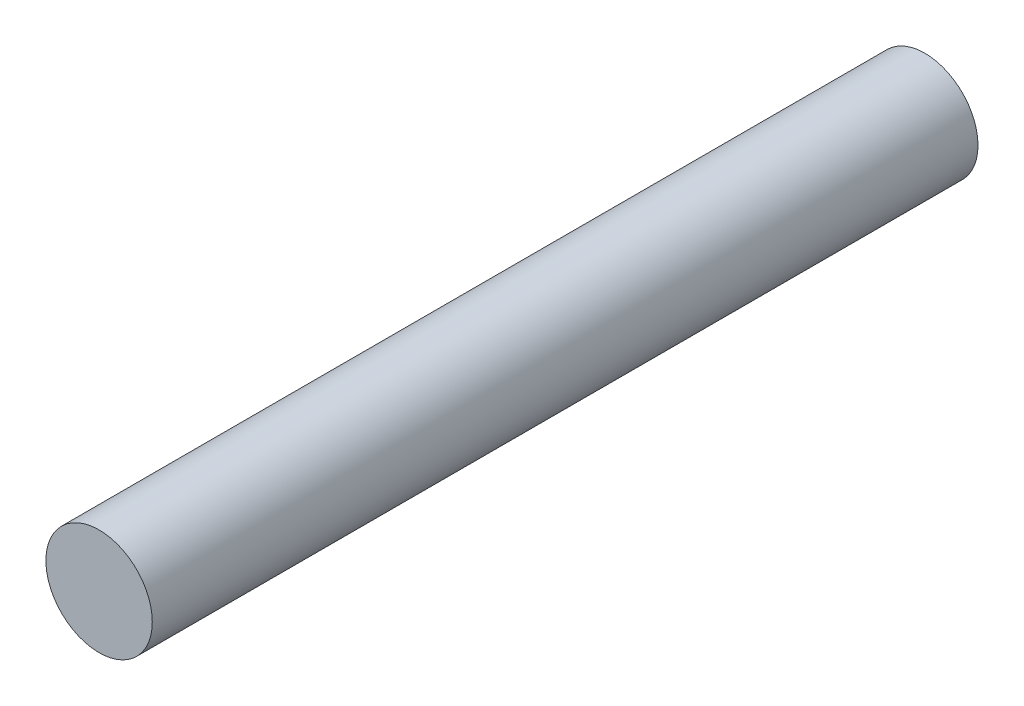
ISO-10303-21;
HEADER;
FILE_DESCRIPTION(('STEP AP214'),'2;1');
FILE_NAME('part.step','',(''),(''),'','','');
FILE_SCHEMA(('AUTOMOTIVE_DESIGN { 1 0 10303 214 1 1 1 1 }'));
ENDSEC;
DATA;
#1=APPLICATION_CONTEXT('core data for automotive mechanical design processes');
#2=APPLICATION_PROTOCOL_DEFINITION('international standard','automotive_design',2000,#1);
#3=PRODUCT_CONTEXT('',#1,'mechanical');
#4=PRODUCT('Part','Part','',(#3));
#5=PRODUCT_RELATED_PRODUCT_CATEGORY('part','',(#4));
#6=PRODUCT_DEFINITION_FORMATION('','',#4);
#7=PRODUCT_DEFINITION_CONTEXT('part definition',#1,'design');
#8=PRODUCT_DEFINITION('design','',#6,#7);
#9=PRODUCT_DEFINITION_SHAPE('','',#8);
#10=(LENGTH_UNIT() NAMED_UNIT(*) SI_UNIT(.MILLI.,.METRE.));
#11=(NAMED_UNIT(*) PLANE_ANGLE_UNIT() SI_UNIT($,.RADIAN.));
#12=(NAMED_UNIT(*) SI_UNIT($,.STERADIAN.) SOLID_ANGLE_UNIT());
#13=UNCERTAINTY_MEASURE_WITH_UNIT(LENGTH_MEASURE(1.E-05),#10,'distance_accuracy_value','');
#14=(GEOMETRIC_REPRESENTATION_CONTEXT(3) GLOBAL_UNCERTAINTY_ASSIGNED_CONTEXT((#13)) GLOBAL_UNIT_ASSIGNED_CONTEXT((#10,
#11,#12)) REPRESENTATION_CONTEXT('',''));
#15=CARTESIAN_POINT('',(0.,0.,0.));
#16=DIRECTION('',(0.,0.,1.));
#17=DIRECTION('',(1.,0.,0.));
#18=AXIS2_PLACEMENT_3D('',#15,#16,#17);
#19=CARTESIAN_POINT('',(0.,0.,62.1));
#20=DIRECTION('',(0.,0.,-1.));
#21=DIRECTION('',(-1.,0.,0.));
#22=AXIS2_PLACEMENT_3D('',#19,#20,#21);
#23=CYLINDRICAL_SURFACE('',#22,4.);
#24=CARTESIAN_POINT('',(0.,0.,62.1));
#25=DIRECTION('',(0.,0.,1.));
#26=DIRECTION('',(1.,0.,0.));
#27=AXIS2_PLACEMENT_3D('',#24,#25,#26);
#28=CIRCLE('',#27,4.);
#29=CARTESIAN_POINT('',(4.,0.,62.1));
#30=VERTEX_POINT('',#29);
#31=EDGE_CURVE('E10',#30,#30,#28,.T.);
#32=ORIENTED_EDGE('',*,*,#31,.F.);
#33=EDGE_LOOP('',(#32));
#34=FACE_BOUND('',#33,.T.);
#35=CARTESIAN_POINT('',(0.,0.,0.));
#36=DIRECTION('',(0.,0.,1.));
#37=DIRECTION('',(1.,0.,0.));
#38=AXIS2_PLACEMENT_3D('',#35,#36,#37);
#39=CIRCLE('',#38,4.);
#40=CARTESIAN_POINT('',(4.,0.,0.));
#41=VERTEX_POINT('',#40);
#42=EDGE_CURVE('E35',#41,#41,#39,.T.);
#43=ORIENTED_EDGE('',*,*,#42,.T.);
#44=EDGE_LOOP('',(#43));
#45=FACE_BOUND('',#44,.T.);
#46=ADVANCED_FACE('F32',(#34,#45),#23,.T.);
#47=CARTESIAN_POINT('',(0.,0.,62.1));
#48=DIRECTION('',(0.,0.,1.));
#49=DIRECTION('',(1.,0.,0.));
#50=AXIS2_PLACEMENT_3D('',#47,#48,#49);
#51=PLANE('',#50);
#52=ORIENTED_EDGE('',*,*,#31,.T.);
#53=EDGE_LOOP('',(#52));
#54=FACE_BOUND('',#53,.T.);
#55=ADVANCED_FACE('F47',(#54),#51,.T.);
#56=CARTESIAN_POINT('',(0.,0.,0.));
#57=DIRECTION('',(0.,0.,1.));
#58=DIRECTION('',(1.,0.,0.));
#59=AXIS2_PLACEMENT_3D('',#56,#57,#58);
#60=PLANE('',#59);
#61=ORIENTED_EDGE('',*,*,#42,.F.);
#62=EDGE_LOOP('',(#61));
#63=FACE_BOUND('',#62,.T.);
#64=ADVANCED_FACE('F45',(#63),#60,.F.);
#65=CLOSED_SHELL('',(#46,#55,#64));
#66=MANIFOLD_SOLID_BREP('B2',#65);
#67=ADVANCED_BREP_SHAPE_REPRESENTATION('',(#18,#66),#14);
#68=SHAPE_DEFINITION_REPRESENTATION(#9,#67);
ENDSEC;
END-ISO-10303-21;
